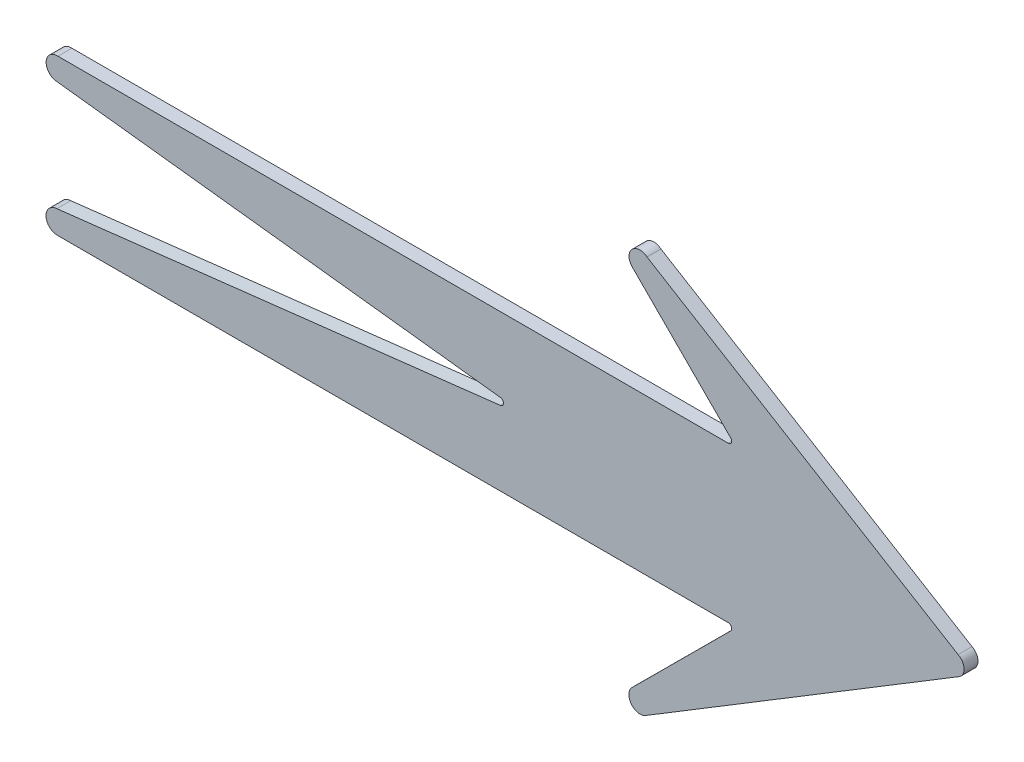
ISO-10303-21;
HEADER;
FILE_DESCRIPTION(('STEP AP214'),'2;1');
FILE_NAME('part.step','',(''),(''),'','','');
FILE_SCHEMA(('AUTOMOTIVE_DESIGN { 1 0 10303 214 1 1 1 1 }'));
ENDSEC;
DATA;
#1=APPLICATION_CONTEXT('core data for automotive mechanical design processes');
#2=APPLICATION_PROTOCOL_DEFINITION('international standard','automotive_design',2000,#1);
#3=PRODUCT_CONTEXT('',#1,'mechanical');
#4=PRODUCT('Part','Part','',(#3));
#5=PRODUCT_RELATED_PRODUCT_CATEGORY('part','',(#4));
#6=PRODUCT_DEFINITION_FORMATION('','',#4);
#7=PRODUCT_DEFINITION_CONTEXT('part definition',#1,'design');
#8=PRODUCT_DEFINITION('design','',#6,#7);
#9=PRODUCT_DEFINITION_SHAPE('','',#8);
#10=(LENGTH_UNIT() NAMED_UNIT(*) SI_UNIT(.MILLI.,.METRE.));
#11=(NAMED_UNIT(*) PLANE_ANGLE_UNIT() SI_UNIT($,.RADIAN.));
#12=(NAMED_UNIT(*) SI_UNIT($,.STERADIAN.) SOLID_ANGLE_UNIT());
#13=UNCERTAINTY_MEASURE_WITH_UNIT(LENGTH_MEASURE(1.E-05),#10,'distance_accuracy_value','');
#14=(GEOMETRIC_REPRESENTATION_CONTEXT(3) GLOBAL_UNCERTAINTY_ASSIGNED_CONTEXT((#13)) GLOBAL_UNIT_ASSIGNED_CONTEXT((#10,
#11,#12)) REPRESENTATION_CONTEXT('',''));
#15=CARTESIAN_POINT('',(0.,0.,0.));
#16=DIRECTION('',(0.,0.,1.));
#17=DIRECTION('',(1.,0.,0.));
#18=AXIS2_PLACEMENT_3D('',#15,#16,#17);
#19=CARTESIAN_POINT('',(0.,0.,0.05));
#20=DIRECTION('',(0.,0.,1.));
#21=DIRECTION('',(1.,0.,0.));
#22=AXIS2_PLACEMENT_3D('',#19,#20,#21);
#23=PLANE('',#22);
#24=CARTESIAN_POINT('',(0.8212215927772,-0.05735469469906,0.05));
#25=DIRECTION('',(0.,0.,1.));
#26=DIRECTION('',(1.,0.,0.));
#27=AXIS2_PLACEMENT_3D('',#24,#25,#26);
#28=CIRCLE('',#27,0.01240017081256);
#29=CARTESIAN_POINT('',(0.820928,-0.0449579999999958,0.05));
#30=VERTEX_POINT('',#29);
#31=CARTESIAN_POINT('',(0.830072000000016,-0.0660400000000156,0.05));
#32=VERTEX_POINT('',#31);
#33=EDGE_CURVE('E20',#30,#32,#28,.F.);
#34=ORIENTED_EDGE('',*,*,#33,.T.);
#35=DIRECTION('',(-0.70812787241249,-0.70608421332909,0.));
#36=VECTOR('',#35,1.);
#37=CARTESIAN_POINT('',(0.830072,-0.06604,0.05));
#38=LINE('',#37,#36);
#39=CARTESIAN_POINT('',(0.478028000000069,-0.417067999999941,0.05));
#40=VERTEX_POINT('',#39);
#41=EDGE_CURVE('E130',#40,#32,#38,.F.);
#42=ORIENTED_EDGE('',*,*,#41,.F.);
#43=CARTESIAN_POINT('',(0.504063,-0.448056,0.05));
#44=DIRECTION('',(0.,0.,1.));
#45=DIRECTION('',(1.,0.,0.));
#46=AXIS2_PLACEMENT_3D('',#43,#44,#45);
#47=CIRCLE('',#46,0.04047316850705);
#48=CARTESIAN_POINT('',(0.530098000000002,-0.479043999999999,0.05));
#49=VERTEX_POINT('',#48);
#50=EDGE_CURVE('E140',#49,#40,#47,.F.);
#51=ORIENTED_EDGE('',*,*,#50,.F.);
#52=DIRECTION('',(0.854704427892851,0.51911495927237,0.));
#53=VECTOR('',#52,1.);
#54=CARTESIAN_POINT('',(0.530098,-0.479044,0.05));
#55=LINE('',#54,#53);
#56=CARTESIAN_POINT('',(1.64795199999954,0.199897999999699,0.05));
#57=VERTEX_POINT('',#56);
#58=EDGE_CURVE('E189',#57,#49,#55,.F.);
#59=ORIENTED_EDGE('',*,*,#58,.F.);
#60=CARTESIAN_POINT('',(1.631057388962,0.234442,0.05));
#61=DIRECTION('',(0.,0.,1.));
#62=DIRECTION('',(1.,0.,0.));
#63=AXIS2_PLACEMENT_3D('',#60,#61,#62);
#64=CIRCLE('',#63,0.03845407414216);
#65=CARTESIAN_POINT('',(1.64795199999967,0.268986000000202,0.05));
#66=VERTEX_POINT('',#65);
#67=EDGE_CURVE('E186',#66,#57,#64,.F.);
#68=ORIENTED_EDGE('',*,*,#67,.F.);
#69=DIRECTION('',(-0.854913559303608,0.518770475373105,0.));
#70=VECTOR('',#69,1.);
#71=CARTESIAN_POINT('',(1.647952,0.268986,0.05));
#72=LINE('',#71,#70);
#73=CARTESIAN_POINT('',(0.529081999999996,0.947927999999997,0.05));
#74=VERTEX_POINT('',#73);
#75=EDGE_CURVE('E183',#74,#66,#72,.F.);
#76=ORIENTED_EDGE('',*,*,#75,.F.);
#77=CARTESIAN_POINT('',(0.503555,0.917956,0.05));
#78=DIRECTION('',(0.,0.,1.));
#79=DIRECTION('',(1.,0.,0.));
#80=AXIS2_PLACEMENT_3D('',#77,#78,#79);
#81=CIRCLE('',#80,0.03936938547907);
#82=CARTESIAN_POINT('',(0.478027999999978,0.887984000000022,0.05));
#83=VERTEX_POINT('',#82);
#84=EDGE_CURVE('E180',#83,#74,#81,.F.);
#85=ORIENTED_EDGE('',*,*,#84,.F.);
#86=DIRECTION('',(0.706087162325974,-0.708124931914174,0.));
#87=VECTOR('',#86,1.);
#88=CARTESIAN_POINT('',(0.478028,0.887984,0.05));
#89=LINE('',#88,#87);
#90=CARTESIAN_POINT('',(0.830072000000008,0.534924000000008,0.05));
#91=VERTEX_POINT('',#90);
#92=EDGE_CURVE('E177',#91,#83,#89,.F.);
#93=ORIENTED_EDGE('',*,*,#92,.F.);
#94=CARTESIAN_POINT('',(0.8212606785886,0.5263711654977,0.05));
#95=DIRECTION('',(0.,0.,1.));
#96=DIRECTION('',(1.,0.,0.));
#97=AXIS2_PLACEMENT_3D('',#94,#95,#96);
#98=CIRCLE('',#97,0.01227967275781);
#99=CARTESIAN_POINT('',(0.820928,0.514096,0.05));
#100=VERTEX_POINT('',#99);
#101=EDGE_CURVE('E174',#91,#100,#98,.F.);
#102=ORIENTED_EDGE('',*,*,#101,.T.);
#103=DIRECTION('',(1.,0.,0.));
#104=VECTOR('',#103,1.);
#105=CARTESIAN_POINT('',(0.820928,0.514096,0.05));
#106=LINE('',#105,#104);
#107=CARTESIAN_POINT('',(-1.59004000000003,0.514095999999999,0.05));
#108=VERTEX_POINT('',#107);
#109=EDGE_CURVE('E170',#108,#100,#106,.T.);
#110=ORIENTED_EDGE('',*,*,#109,.F.);
#111=CARTESIAN_POINT('',(-1.592072,0.473583,0.05));
#112=DIRECTION('',(0.,0.,1.));
#113=DIRECTION('',(1.,0.,0.));
#114=AXIS2_PLACEMENT_3D('',#111,#112,#113);
#115=CIRCLE('',#114,0.04056392723837);
#116=CARTESIAN_POINT('',(-1.59410400000002,0.433070000000002,0.05));
#117=VERTEX_POINT('',#116);
#118=EDGE_CURVE('E167',#117,#108,#115,.F.);
#119=ORIENTED_EDGE('',*,*,#118,.F.);
#120=DIRECTION('',(0.993257069577004,-0.1159327121019,0.));
#121=VECTOR('',#120,1.);
#122=CARTESIAN_POINT('',(-1.594104,0.43307,0.05));
#123=LINE('',#122,#121);
#124=CARTESIAN_POINT('',(0.00101600000006485,0.246887999999992,0.05));
#125=VERTEX_POINT('',#124);
#126=EDGE_CURVE('E164',#125,#117,#123,.F.);
#127=ORIENTED_EDGE('',*,*,#126,.F.);
#128=CARTESIAN_POINT('',(0.0001957812551157,0.234442,0.05));
#129=DIRECTION('',(0.,0.,1.));
#130=DIRECTION('',(1.,0.,0.));
#131=AXIS2_PLACEMENT_3D('',#128,#129,#130);
#132=CIRCLE('',#131,0.01247299782688);
#133=CARTESIAN_POINT('',(0.00101600000004294,0.221996000000005,0.05));
#134=VERTEX_POINT('',#133);
#135=EDGE_CURVE('E161',#125,#134,#132,.F.);
#136=ORIENTED_EDGE('',*,*,#135,.T.);
#137=DIRECTION('',(-0.993347833959567,-0.115152424064096,0.));
#138=VECTOR('',#137,1.);
#139=CARTESIAN_POINT('',(0.001016,0.221996,0.05));
#140=LINE('',#139,#138);
#141=CARTESIAN_POINT('',(-1.59410400000007,0.0370840000000003,0.05));
#142=VERTEX_POINT('',#141);
#143=EDGE_CURVE('E157',#142,#134,#140,.F.);
#144=ORIENTED_EDGE('',*,*,#143,.F.);
#145=CARTESIAN_POINT('',(-1.592072,-0.003937,0.05));
#146=DIRECTION('',(0.,0.,1.));
#147=DIRECTION('',(1.,0.,0.));
#148=AXIS2_PLACEMENT_3D('',#145,#146,#147);
#149=CIRCLE('',#148,0.04107129733768);
#150=CARTESIAN_POINT('',(-1.59003999999999,-0.044958,0.05));
#151=VERTEX_POINT('',#150);
#152=EDGE_CURVE('E154',#151,#142,#149,.F.);
#153=ORIENTED_EDGE('',*,*,#152,.F.);
#154=DIRECTION('',(1.,0.,0.));
#155=VECTOR('',#154,1.);
#156=CARTESIAN_POINT('',(-1.59004,-0.044958,0.05));
#157=LINE('',#156,#155);
#158=EDGE_CURVE('E133',#30,#151,#157,.F.);
#159=ORIENTED_EDGE('',*,*,#158,.F.);
#160=EDGE_LOOP('',(#34,#42,#51,#59,#68,#76,#85,#93,#102,#110,#119,#127,#136,#144,#153,#159));
#161=FACE_BOUND('',#160,.T.);
#162=ADVANCED_FACE('F17',(#161),#23,.T.);
#163=CARTESIAN_POINT('',(0.830072,-0.06604,0.));
#164=DIRECTION('',(-0.70608421332909,0.70812787241249,0.));
#165=DIRECTION('',(-0.70812787241249,-0.70608421332909,0.));
#166=AXIS2_PLACEMENT_3D('',#163,#164,#165);
#167=PLANE('',#166);
#168=DIRECTION('',(0.,0.,1.));
#169=VECTOR('',#168,1.);
#170=CARTESIAN_POINT('',(0.830072000000021,-0.0660400000000208,0.));
#171=LINE('',#170,#169);
#172=CARTESIAN_POINT('',(0.830072000000011,-0.0660400000000104,0.));
#173=VERTEX_POINT('',#172);
#174=EDGE_CURVE('E138',#32,#173,#171,.F.);
#175=ORIENTED_EDGE('',*,*,#174,.T.);
#176=DIRECTION('',(-0.708127872412511,-0.706084213329069,0.));
#177=VECTOR('',#176,1.);
#178=CARTESIAN_POINT('',(0.830072,-0.06604,0.));
#179=LINE('',#178,#177);
#180=CARTESIAN_POINT('',(0.478028000000003,-0.417067999999997,0.));
#181=VERTEX_POINT('',#180);
#182=EDGE_CURVE('E143',#173,#181,#179,.T.);
#183=ORIENTED_EDGE('',*,*,#182,.T.);
#184=DIRECTION('',(0.,0.,1.));
#185=VECTOR('',#184,1.);
#186=CARTESIAN_POINT('',(0.478028,-0.417067999999999,0.));
#187=LINE('',#186,#185);
#188=EDGE_CURVE('E139',#40,#181,#187,.F.);
#189=ORIENTED_EDGE('',*,*,#188,.F.);
#190=ORIENTED_EDGE('',*,*,#41,.T.);
#191=EDGE_LOOP('',(#175,#183,#189,#190));
#192=FACE_BOUND('',#191,.T.);
#193=ADVANCED_FACE('F136',(#192),#167,.T.);
#194=CARTESIAN_POINT('',(0.504063,-0.448056,0.));
#195=DIRECTION('',(0.,0.,1.));
#196=DIRECTION('',(1.,0.,0.));
#197=AXIS2_PLACEMENT_3D('',#194,#195,#196);
#198=CYLINDRICAL_SURFACE('',#197,0.04047316850705);
#199=ORIENTED_EDGE('',*,*,#188,.T.);
#200=CARTESIAN_POINT('',(0.504063,-0.448056,0.));
#201=DIRECTION('',(0.,0.,1.));
#202=DIRECTION('',(1.,0.,0.));
#203=AXIS2_PLACEMENT_3D('',#200,#201,#202);
#204=CIRCLE('',#203,0.04047316850705);
#205=CARTESIAN_POINT('',(0.530098000000002,-0.479043999999999,0.));
#206=VERTEX_POINT('',#205);
#207=EDGE_CURVE('E145',#181,#206,#204,.T.);
#208=ORIENTED_EDGE('',*,*,#207,.T.);
#209=DIRECTION('',(0.,0.,1.));
#210=VECTOR('',#209,1.);
#211=CARTESIAN_POINT('',(0.530098,-0.479044,0.));
#212=LINE('',#211,#210);
#213=EDGE_CURVE('E187',#49,#206,#212,.F.);
#214=ORIENTED_EDGE('',*,*,#213,.F.);
#215=ORIENTED_EDGE('',*,*,#50,.T.);
#216=EDGE_LOOP('',(#199,#208,#214,#215));
#217=FACE_BOUND('',#216,.T.);
#218=ADVANCED_FACE('F233',(#217),#198,.T.);
#219=CARTESIAN_POINT('',(0.530098,-0.479044,0.));
#220=DIRECTION('',(0.51911495927237,-0.854704427892851,0.));
#221=DIRECTION('',(0.854704427892851,0.51911495927237,0.));
#222=AXIS2_PLACEMENT_3D('',#219,#220,#221);
#223=PLANE('',#222);
#224=ORIENTED_EDGE('',*,*,#213,.T.);
#225=DIRECTION('',(0.854704427892862,0.519114959272352,0.));
#226=VECTOR('',#225,1.);
#227=CARTESIAN_POINT('',(0.530098,-0.479044,0.));
#228=LINE('',#227,#226);
#229=CARTESIAN_POINT('',(1.64795199999968,0.199897999999767,0.));
#230=VERTEX_POINT('',#229);
#231=EDGE_CURVE('E221',#206,#230,#228,.T.);
#232=ORIENTED_EDGE('',*,*,#231,.T.);
#233=DIRECTION('',(0.,0.,1.));
#234=VECTOR('',#233,1.);
#235=CARTESIAN_POINT('',(1.64795200000003,0.199897999999937,0.));
#236=LINE('',#235,#234);
#237=EDGE_CURVE('E184',#57,#230,#236,.F.);
#238=ORIENTED_EDGE('',*,*,#237,.F.);
#239=ORIENTED_EDGE('',*,*,#58,.T.);
#240=EDGE_LOOP('',(#224,#232,#238,#239));
#241=FACE_BOUND('',#240,.T.);
#242=ADVANCED_FACE('F242',(#241),#223,.T.);
#243=CARTESIAN_POINT('',(1.631057388962,0.234442,0.));
#244=DIRECTION('',(0.,0.,1.));
#245=DIRECTION('',(1.,0.,0.));
#246=AXIS2_PLACEMENT_3D('',#243,#244,#245);
#247=CYLINDRICAL_SURFACE('',#246,0.03845407414216);
#248=ORIENTED_EDGE('',*,*,#237,.T.);
#249=CARTESIAN_POINT('',(1.631057388962,0.234442,0.));
#250=DIRECTION('',(0.,0.,1.));
#251=DIRECTION('',(1.,0.,0.));
#252=AXIS2_PLACEMENT_3D('',#249,#250,#251);
#253=CIRCLE('',#252,0.03845407414216);
#254=CARTESIAN_POINT('',(1.64795199999967,0.268986000000202,0.));
#255=VERTEX_POINT('',#254);
#256=EDGE_CURVE('E218',#230,#255,#253,.T.);
#257=ORIENTED_EDGE('',*,*,#256,.T.);
#258=DIRECTION('',(0.,0.,1.));
#259=VECTOR('',#258,1.);
#260=CARTESIAN_POINT('',(1.647952,0.268986,0.));
#261=LINE('',#260,#259);
#262=EDGE_CURVE('E181',#66,#255,#261,.F.);
#263=ORIENTED_EDGE('',*,*,#262,.F.);
#264=ORIENTED_EDGE('',*,*,#67,.T.);
#265=EDGE_LOOP('',(#248,#257,#263,#264));
#266=FACE_BOUND('',#265,.T.);
#267=ADVANCED_FACE('F246',(#266),#247,.T.);
#268=CARTESIAN_POINT('',(1.647952,0.268986,0.));
#269=DIRECTION('',(0.518770475373105,0.854913559303608,0.));
#270=DIRECTION('',(-0.854913559303608,0.518770475373105,0.));
#271=AXIS2_PLACEMENT_3D('',#268,#269,#270);
#272=PLANE('',#271);
#273=ORIENTED_EDGE('',*,*,#262,.T.);
#274=DIRECTION('',(-0.854913559303606,0.518770475373107,0.));
#275=VECTOR('',#274,1.);
#276=CARTESIAN_POINT('',(1.647952,0.268986,0.));
#277=LINE('',#276,#275);
#278=CARTESIAN_POINT('',(0.529081999999985,0.947928000000006,0.));
#279=VERTEX_POINT('',#278);
#280=EDGE_CURVE('E217',#255,#279,#277,.T.);
#281=ORIENTED_EDGE('',*,*,#280,.T.);
#282=DIRECTION('',(0.,0.,1.));
#283=VECTOR('',#282,1.);
#284=CARTESIAN_POINT('',(0.529081999999997,0.947927999999996,0.));
#285=LINE('',#284,#283);
#286=EDGE_CURVE('E178',#74,#279,#285,.F.);
#287=ORIENTED_EDGE('',*,*,#286,.F.);
#288=ORIENTED_EDGE('',*,*,#75,.T.);
#289=EDGE_LOOP('',(#273,#281,#287,#288));
#290=FACE_BOUND('',#289,.T.);
#291=ADVANCED_FACE('F307',(#290),#272,.T.);
#292=CARTESIAN_POINT('',(0.503555,0.917956,0.));
#293=DIRECTION('',(0.,0.,1.));
#294=DIRECTION('',(1.,0.,0.));
#295=AXIS2_PLACEMENT_3D('',#292,#293,#294);
#296=CYLINDRICAL_SURFACE('',#295,0.03936938547907);
#297=ORIENTED_EDGE('',*,*,#286,.T.);
#298=CARTESIAN_POINT('',(0.503555,0.917956,0.));
#299=DIRECTION('',(0.,0.,1.));
#300=DIRECTION('',(1.,0.,0.));
#301=AXIS2_PLACEMENT_3D('',#298,#299,#300);
#302=CIRCLE('',#301,0.03936938547907);
#303=CARTESIAN_POINT('',(0.478027999999978,0.887984000000022,0.));
#304=VERTEX_POINT('',#303);
#305=EDGE_CURVE('E214',#279,#304,#302,.T.);
#306=ORIENTED_EDGE('',*,*,#305,.T.);
#307=DIRECTION('',(0.,0.,1.));
#308=VECTOR('',#307,1.);
#309=CARTESIAN_POINT('',(0.478028,0.887984,0.));
#310=LINE('',#309,#308);
#311=EDGE_CURVE('E175',#83,#304,#310,.F.);
#312=ORIENTED_EDGE('',*,*,#311,.F.);
#313=ORIENTED_EDGE('',*,*,#84,.T.);
#314=EDGE_LOOP('',(#297,#306,#312,#313));
#315=FACE_BOUND('',#314,.T.);
#316=ADVANCED_FACE('F306',(#315),#296,.T.);
#317=CARTESIAN_POINT('',(0.478028,0.887984,0.));
#318=DIRECTION('',(-0.708124931914174,-0.706087162325974,0.));
#319=DIRECTION('',(0.706087162325974,-0.708124931914174,0.));
#320=AXIS2_PLACEMENT_3D('',#317,#318,#319);
#321=PLANE('',#320);
#322=ORIENTED_EDGE('',*,*,#311,.T.);
#323=DIRECTION('',(0.706087162325953,-0.708124931914195,0.));
#324=VECTOR('',#323,1.);
#325=CARTESIAN_POINT('',(0.478028,0.887984,0.));
#326=LINE('',#325,#324);
#327=CARTESIAN_POINT('',(0.830072000000004,0.534924000000004,0.));
#328=VERTEX_POINT('',#327);
#329=EDGE_CURVE('E213',#304,#328,#326,.T.);
#330=ORIENTED_EDGE('',*,*,#329,.T.);
#331=DIRECTION('',(0.,0.,1.));
#332=VECTOR('',#331,1.);
#333=CARTESIAN_POINT('',(0.830072000000005,0.534924000000005,0.));
#334=LINE('',#333,#332);
#335=EDGE_CURVE('E171',#328,#91,#334,.T.);
#336=ORIENTED_EDGE('',*,*,#335,.T.);
#337=ORIENTED_EDGE('',*,*,#92,.T.);
#338=EDGE_LOOP('',(#322,#330,#336,#337));
#339=FACE_BOUND('',#338,.T.);
#340=ADVANCED_FACE('F302',(#339),#321,.T.);
#341=CARTESIAN_POINT('',(0.8212606785886,0.5263711654977,0.));
#342=DIRECTION('',(0.,0.,1.));
#343=DIRECTION('',(1.,0.,0.));
#344=AXIS2_PLACEMENT_3D('',#341,#342,#343);
#345=CYLINDRICAL_SURFACE('',#344,0.01227967275781);
#346=ORIENTED_EDGE('',*,*,#101,.F.);
#347=ORIENTED_EDGE('',*,*,#335,.F.);
#348=CARTESIAN_POINT('',(0.8212606785886,0.5263711654977,0.));
#349=DIRECTION('',(0.,0.,1.));
#350=DIRECTION('',(1.,0.,0.));
#351=AXIS2_PLACEMENT_3D('',#348,#349,#350);
#352=CIRCLE('',#351,0.01227967275781);
#353=CARTESIAN_POINT('',(0.820928,0.514096,0.));
#354=VERTEX_POINT('',#353);
#355=EDGE_CURVE('E210',#328,#354,#352,.F.);
#356=ORIENTED_EDGE('',*,*,#355,.T.);
#357=DIRECTION('',(0.,0.,1.));
#358=VECTOR('',#357,1.);
#359=CARTESIAN_POINT('',(0.820928,0.514096,0.));
#360=LINE('',#359,#358);
#361=EDGE_CURVE('E168',#100,#354,#360,.F.);
#362=ORIENTED_EDGE('',*,*,#361,.F.);
#363=EDGE_LOOP('',(#346,#347,#356,#362));
#364=FACE_BOUND('',#363,.T.);
#365=ADVANCED_FACE('F300',(#364),#345,.F.);
#366=CARTESIAN_POINT('',(0.820928,0.514096,0.));
#367=DIRECTION('',(0.,1.,0.));
#368=DIRECTION('',(0.,0.,1.));
#369=AXIS2_PLACEMENT_3D('',#366,#367,#368);
#370=PLANE('',#369);
#371=ORIENTED_EDGE('',*,*,#361,.T.);
#372=DIRECTION('',(1.,0.,0.));
#373=VECTOR('',#372,1.);
#374=CARTESIAN_POINT('',(0.,0.514096,0.));
#375=LINE('',#374,#373);
#376=CARTESIAN_POINT('',(-1.59004000000003,0.514095999999999,0.));
#377=VERTEX_POINT('',#376);
#378=EDGE_CURVE('E209',#354,#377,#375,.F.);
#379=ORIENTED_EDGE('',*,*,#378,.T.);
#380=DIRECTION('',(0.,0.,1.));
#381=VECTOR('',#380,1.);
#382=CARTESIAN_POINT('',(-1.59004,0.514095999999997,0.));
#383=LINE('',#382,#381);
#384=EDGE_CURVE('E165',#108,#377,#383,.F.);
#385=ORIENTED_EDGE('',*,*,#384,.F.);
#386=ORIENTED_EDGE('',*,*,#109,.T.);
#387=EDGE_LOOP('',(#371,#379,#385,#386));
#388=FACE_BOUND('',#387,.T.);
#389=ADVANCED_FACE('F295',(#388),#370,.T.);
#390=CARTESIAN_POINT('',(-1.592072,0.473583,0.));
#391=DIRECTION('',(0.,0.,1.));
#392=DIRECTION('',(1.,0.,0.));
#393=AXIS2_PLACEMENT_3D('',#390,#391,#392);
#394=CYLINDRICAL_SURFACE('',#393,0.04056392723837);
#395=ORIENTED_EDGE('',*,*,#384,.T.);
#396=CARTESIAN_POINT('',(-1.592072,0.473583,0.));
#397=DIRECTION('',(0.,0.,1.));
#398=DIRECTION('',(1.,0.,0.));
#399=AXIS2_PLACEMENT_3D('',#396,#397,#398);
#400=CIRCLE('',#399,0.04056392723837);
#401=CARTESIAN_POINT('',(-1.59410400000002,0.433070000000002,0.));
#402=VERTEX_POINT('',#401);
#403=EDGE_CURVE('E206',#377,#402,#400,.T.);
#404=ORIENTED_EDGE('',*,*,#403,.T.);
#405=DIRECTION('',(0.,0.,1.));
#406=VECTOR('',#405,1.);
#407=CARTESIAN_POINT('',(-1.594104,0.43307,0.));
#408=LINE('',#407,#406);
#409=EDGE_CURVE('E162',#117,#402,#408,.F.);
#410=ORIENTED_EDGE('',*,*,#409,.F.);
#411=ORIENTED_EDGE('',*,*,#118,.T.);
#412=EDGE_LOOP('',(#395,#404,#410,#411));
#413=FACE_BOUND('',#412,.T.);
#414=ADVANCED_FACE('F291',(#413),#394,.T.);
#415=CARTESIAN_POINT('',(-1.594104,0.43307,0.));
#416=DIRECTION('',(-0.1159327121019,-0.993257069577004,0.));
#417=DIRECTION('',(0.993257069577004,-0.1159327121019,0.));
#418=AXIS2_PLACEMENT_3D('',#415,#416,#417);
#419=PLANE('',#418);
#420=ORIENTED_EDGE('',*,*,#409,.T.);
#421=DIRECTION('',(0.993257069577004,-0.115932712101902,0.));
#422=VECTOR('',#421,1.);
#423=CARTESIAN_POINT('',(-1.594104,0.43307,0.));
#424=LINE('',#423,#422);
#425=CARTESIAN_POINT('',(0.00101600000004176,0.246887999999993,0.));
#426=VERTEX_POINT('',#425);
#427=EDGE_CURVE('E205',#402,#426,#424,.T.);
#428=ORIENTED_EDGE('',*,*,#427,.T.);
#429=DIRECTION('',(0.,0.,1.));
#430=VECTOR('',#429,1.);
#431=CARTESIAN_POINT('',(0.00101599999999972,0.246887999999996,0.));
#432=LINE('',#431,#430);
#433=EDGE_CURVE('E158',#426,#125,#432,.T.);
#434=ORIENTED_EDGE('',*,*,#433,.T.);
#435=ORIENTED_EDGE('',*,*,#126,.T.);
#436=EDGE_LOOP('',(#420,#428,#434,#435));
#437=FACE_BOUND('',#436,.T.);
#438=ADVANCED_FACE('F285',(#437),#419,.T.);
#439=CARTESIAN_POINT('',(0.0001957812551157,0.234442,0.));
#440=DIRECTION('',(0.,0.,1.));
#441=DIRECTION('',(1.,0.,0.));
#442=AXIS2_PLACEMENT_3D('',#439,#440,#441);
#443=CYLINDRICAL_SURFACE('',#442,0.01247299782688);
#444=ORIENTED_EDGE('',*,*,#135,.F.);
#445=ORIENTED_EDGE('',*,*,#433,.F.);
#446=CARTESIAN_POINT('',(0.0001957812551157,0.234442,0.));
#447=DIRECTION('',(0.,0.,1.));
#448=DIRECTION('',(1.,0.,0.));
#449=AXIS2_PLACEMENT_3D('',#446,#447,#448);
#450=CIRCLE('',#449,0.01247299782688);
#451=CARTESIAN_POINT('',(0.00101600000004294,0.221996000000005,0.));
#452=VERTEX_POINT('',#451);
#453=EDGE_CURVE('E202',#426,#452,#450,.F.);
#454=ORIENTED_EDGE('',*,*,#453,.T.);
#455=DIRECTION('',(0.,0.,1.));
#456=VECTOR('',#455,1.);
#457=CARTESIAN_POINT('',(0.001016,0.221996,0.));
#458=LINE('',#457,#456);
#459=EDGE_CURVE('E155',#134,#452,#458,.F.);
#460=ORIENTED_EDGE('',*,*,#459,.F.);
#461=EDGE_LOOP('',(#444,#445,#454,#460));
#462=FACE_BOUND('',#461,.T.);
#463=ADVANCED_FACE('F283',(#462),#443,.F.);
#464=CARTESIAN_POINT('',(0.001016,0.221996,0.));
#465=DIRECTION('',(-0.115152424064096,0.993347833959567,0.));
#466=DIRECTION('',(-0.993347833959567,-0.115152424064096,0.));
#467=AXIS2_PLACEMENT_3D('',#464,#465,#466);
#468=PLANE('',#467);
#469=ORIENTED_EDGE('',*,*,#459,.T.);
#470=DIRECTION('',(-0.993347833959566,-0.115152424064103,0.));
#471=VECTOR('',#470,1.);
#472=CARTESIAN_POINT('',(0.001016,0.221996,0.));
#473=LINE('',#472,#471);
#474=CARTESIAN_POINT('',(-1.59410399999999,0.037084000000002,0.));
#475=VERTEX_POINT('',#474);
#476=EDGE_CURVE('E201',#452,#475,#473,.T.);
#477=ORIENTED_EDGE('',*,*,#476,.T.);
#478=DIRECTION('',(0.,0.,1.));
#479=VECTOR('',#478,1.);
#480=CARTESIAN_POINT('',(-1.594104,0.0370840000000015,0.));
#481=LINE('',#480,#479);
#482=EDGE_CURVE('E152',#142,#475,#481,.F.);
#483=ORIENTED_EDGE('',*,*,#482,.F.);
#484=ORIENTED_EDGE('',*,*,#143,.T.);
#485=EDGE_LOOP('',(#469,#477,#483,#484));
#486=FACE_BOUND('',#485,.T.);
#487=ADVANCED_FACE('F277',(#486),#468,.T.);
#488=CARTESIAN_POINT('',(-1.592072,-0.003937,0.));
#489=DIRECTION('',(0.,0.,1.));
#490=DIRECTION('',(1.,0.,0.));
#491=AXIS2_PLACEMENT_3D('',#488,#489,#490);
#492=CYLINDRICAL_SURFACE('',#491,0.04107129733768);
#493=ORIENTED_EDGE('',*,*,#482,.T.);
#494=CARTESIAN_POINT('',(-1.592072,-0.003937,0.));
#495=DIRECTION('',(0.,0.,1.));
#496=DIRECTION('',(1.,0.,0.));
#497=AXIS2_PLACEMENT_3D('',#494,#495,#496);
#498=CIRCLE('',#497,0.04107129733768);
#499=CARTESIAN_POINT('',(-1.59003999999999,-0.044958,0.));
#500=VERTEX_POINT('',#499);
#501=EDGE_CURVE('E198',#475,#500,#498,.T.);
#502=ORIENTED_EDGE('',*,*,#501,.T.);
#503=DIRECTION('',(0.,0.,-1.));
#504=VECTOR('',#503,1.);
#505=CARTESIAN_POINT('',(-1.59004,-0.044958,0.));
#506=LINE('',#505,#504);
#507=EDGE_CURVE('E147',#151,#500,#506,.T.);
#508=ORIENTED_EDGE('',*,*,#507,.F.);
#509=ORIENTED_EDGE('',*,*,#152,.T.);
#510=EDGE_LOOP('',(#493,#502,#508,#509));
#511=FACE_BOUND('',#510,.T.);
#512=ADVANCED_FACE('F273',(#511),#492,.T.);
#513=CARTESIAN_POINT('',(-1.59004,-0.044958,0.));
#514=DIRECTION('',(0.,-1.,0.));
#515=DIRECTION('',(0.,0.,-1.));
#516=AXIS2_PLACEMENT_3D('',#513,#514,#515);
#517=PLANE('',#516);
#518=ORIENTED_EDGE('',*,*,#507,.T.);
#519=DIRECTION('',(1.,0.,0.));
#520=VECTOR('',#519,1.);
#521=CARTESIAN_POINT('',(0.,-0.044958,0.));
#522=LINE('',#521,#520);
#523=CARTESIAN_POINT('',(0.820928,-0.0449579999999958,0.));
#524=VERTEX_POINT('',#523);
#525=EDGE_CURVE('E26',#500,#524,#522,.T.);
#526=ORIENTED_EDGE('',*,*,#525,.T.);
#527=DIRECTION('',(0.,0.,1.));
#528=VECTOR('',#527,1.);
#529=CARTESIAN_POINT('',(0.820928,-0.0449579999999944,0.));
#530=LINE('',#529,#528);
#531=EDGE_CURVE('E34',#524,#30,#530,.T.);
#532=ORIENTED_EDGE('',*,*,#531,.T.);
#533=ORIENTED_EDGE('',*,*,#158,.T.);
#534=EDGE_LOOP('',(#518,#526,#532,#533));
#535=FACE_BOUND('',#534,.T.);
#536=ADVANCED_FACE('F268',(#535),#517,.T.);
#537=CARTESIAN_POINT('',(0.8212215927772,-0.05735469469906,0.));
#538=DIRECTION('',(0.,0.,1.));
#539=DIRECTION('',(1.,0.,0.));
#540=AXIS2_PLACEMENT_3D('',#537,#538,#539);
#541=CYLINDRICAL_SURFACE('',#540,0.01240017081256);
#542=ORIENTED_EDGE('',*,*,#33,.F.);
#543=ORIENTED_EDGE('',*,*,#531,.F.);
#544=CARTESIAN_POINT('',(0.8212215927772,-0.05735469469906,0.));
#545=DIRECTION('',(0.,0.,1.));
#546=DIRECTION('',(1.,0.,0.));
#547=AXIS2_PLACEMENT_3D('',#544,#545,#546);
#548=CIRCLE('',#547,0.01240017081256);
#549=EDGE_CURVE('E11',#524,#173,#548,.F.);
#550=ORIENTED_EDGE('',*,*,#549,.T.);
#551=ORIENTED_EDGE('',*,*,#174,.F.);
#552=EDGE_LOOP('',(#542,#543,#550,#551));
#553=FACE_BOUND('',#552,.T.);
#554=ADVANCED_FACE('F142',(#553),#541,.F.);
#555=CARTESIAN_POINT('',(0.,0.,0.));
#556=DIRECTION('',(0.,0.,1.));
#557=DIRECTION('',(1.,0.,0.));
#558=AXIS2_PLACEMENT_3D('',#555,#556,#557);
#559=PLANE('',#558);
#560=ORIENTED_EDGE('',*,*,#525,.F.);
#561=ORIENTED_EDGE('',*,*,#501,.F.);
#562=ORIENTED_EDGE('',*,*,#476,.F.);
#563=ORIENTED_EDGE('',*,*,#453,.F.);
#564=ORIENTED_EDGE('',*,*,#427,.F.);
#565=ORIENTED_EDGE('',*,*,#403,.F.);
#566=ORIENTED_EDGE('',*,*,#378,.F.);
#567=ORIENTED_EDGE('',*,*,#355,.F.);
#568=ORIENTED_EDGE('',*,*,#329,.F.);
#569=ORIENTED_EDGE('',*,*,#305,.F.);
#570=ORIENTED_EDGE('',*,*,#280,.F.);
#571=ORIENTED_EDGE('',*,*,#256,.F.);
#572=ORIENTED_EDGE('',*,*,#231,.F.);
#573=ORIENTED_EDGE('',*,*,#207,.F.);
#574=ORIENTED_EDGE('',*,*,#182,.F.);
#575=ORIENTED_EDGE('',*,*,#549,.F.);
#576=EDGE_LOOP('',(#560,#561,#562,#563,#564,#565,#566,#567,#568,#569,#570,#571,#572,#573,#574,#575));
#577=FACE_BOUND('',#576,.T.);
#578=ADVANCED_FACE('F250',(#577),#559,.F.);
#579=CLOSED_SHELL('',(#162,#193,#218,#242,#267,#291,#316,#340,#365,#389,#414,#438,#463,#487,
#512,#536,#554,#578));
#580=MANIFOLD_SOLID_BREP('B1',#579);
#581=ADVANCED_BREP_SHAPE_REPRESENTATION('',(#18,#580),#14);
#582=SHAPE_DEFINITION_REPRESENTATION(#9,#581);
ENDSEC;
END-ISO-10303-21;
